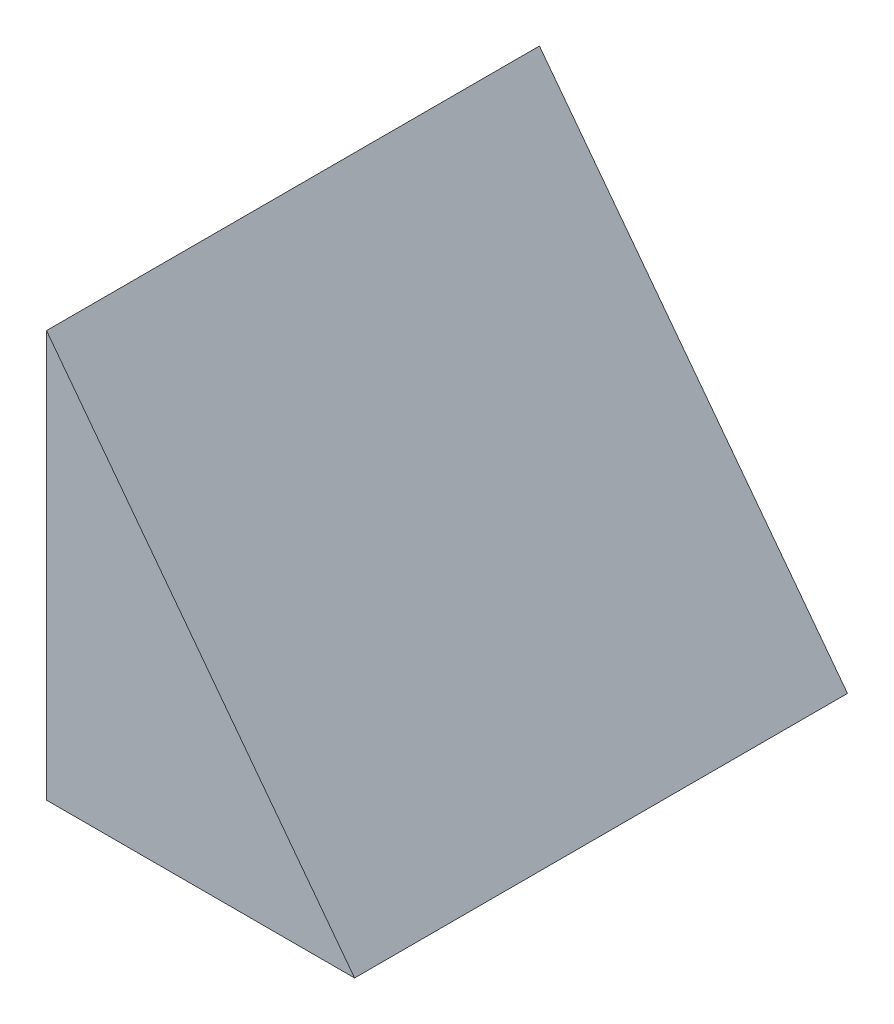
ISO-10303-21;
HEADER;
FILE_DESCRIPTION(('STEP AP214'),'2;1');
FILE_NAME('part.step','',(''),(''),'','','');
FILE_SCHEMA(('AUTOMOTIVE_DESIGN { 1 0 10303 214 1 1 1 1 }'));
ENDSEC;
DATA;
#1=APPLICATION_CONTEXT('core data for automotive mechanical design processes');
#2=APPLICATION_PROTOCOL_DEFINITION('international standard','automotive_design',2000,#1);
#3=PRODUCT_CONTEXT('',#1,'mechanical');
#4=PRODUCT('Part','Part','',(#3));
#5=PRODUCT_RELATED_PRODUCT_CATEGORY('part','',(#4));
#6=PRODUCT_DEFINITION_FORMATION('','',#4);
#7=PRODUCT_DEFINITION_CONTEXT('part definition',#1,'design');
#8=PRODUCT_DEFINITION('design','',#6,#7);
#9=PRODUCT_DEFINITION_SHAPE('','',#8);
#10=(LENGTH_UNIT() NAMED_UNIT(*) SI_UNIT(.MILLI.,.METRE.));
#11=(NAMED_UNIT(*) PLANE_ANGLE_UNIT() SI_UNIT($,.RADIAN.));
#12=(NAMED_UNIT(*) SI_UNIT($,.STERADIAN.) SOLID_ANGLE_UNIT());
#13=UNCERTAINTY_MEASURE_WITH_UNIT(LENGTH_MEASURE(1.E-05),#10,'distance_accuracy_value','');
#14=(GEOMETRIC_REPRESENTATION_CONTEXT(3) GLOBAL_UNCERTAINTY_ASSIGNED_CONTEXT((#13)) GLOBAL_UNIT_ASSIGNED_CONTEXT((#10,
#11,#12)) REPRESENTATION_CONTEXT('',''));
#15=CARTESIAN_POINT('',(0.,0.,0.));
#16=DIRECTION('',(0.,0.,1.));
#17=DIRECTION('',(1.,0.,0.));
#18=AXIS2_PLACEMENT_3D('',#15,#16,#17);
#19=CARTESIAN_POINT('',(635.,0.,-1016.));
#20=DIRECTION('',(0.,-1.,0.));
#21=DIRECTION('',(1.,0.,0.));
#22=AXIS2_PLACEMENT_3D('',#19,#20,#21);
#23=PLANE('',#22);
#24=DIRECTION('',(1.,0.,0.));
#25=VECTOR('',#24,1.);
#26=CARTESIAN_POINT('',(635.,0.,0.));
#27=LINE('',#26,#25);
#28=CARTESIAN_POINT('',(0.,0.,0.));
#29=VERTEX_POINT('',#28);
#30=CARTESIAN_POINT('',(635.,0.,0.));
#31=VERTEX_POINT('',#30);
#32=EDGE_CURVE('E84',#29,#31,#27,.T.);
#33=ORIENTED_EDGE('',*,*,#32,.F.);
#34=DIRECTION('',(0.,0.,1.));
#35=VECTOR('',#34,1.);
#36=CARTESIAN_POINT('',(0.,0.,-1016.));
#37=LINE('',#36,#35);
#38=CARTESIAN_POINT('',(0.,0.,-1016.));
#39=VERTEX_POINT('',#38);
#40=EDGE_CURVE('E11',#39,#29,#37,.T.);
#41=ORIENTED_EDGE('',*,*,#40,.F.);
#42=DIRECTION('',(1.,0.,0.));
#43=VECTOR('',#42,1.);
#44=CARTESIAN_POINT('',(635.,0.,-1016.));
#45=LINE('',#44,#43);
#46=CARTESIAN_POINT('',(635.,0.,-1016.));
#47=VERTEX_POINT('',#46);
#48=EDGE_CURVE('E76',#39,#47,#45,.T.);
#49=ORIENTED_EDGE('',*,*,#48,.T.);
#50=DIRECTION('',(0.,0.,1.));
#51=VECTOR('',#50,1.);
#52=CARTESIAN_POINT('',(635.,0.,-1016.));
#53=LINE('',#52,#51);
#54=EDGE_CURVE('E35',#47,#31,#53,.T.);
#55=ORIENTED_EDGE('',*,*,#54,.T.);
#56=EDGE_LOOP('',(#33,#41,#49,#55));
#57=FACE_BOUND('',#56,.T.);
#58=ADVANCED_FACE('F32',(#57),#23,.T.);
#59=CARTESIAN_POINT('',(0.,0.,-1016.));
#60=DIRECTION('',(-1.,0.,0.));
#61=DIRECTION('',(0.,0.,1.));
#62=AXIS2_PLACEMENT_3D('',#59,#60,#61);
#63=PLANE('',#62);
#64=DIRECTION('',(0.,-1.,0.));
#65=VECTOR('',#64,1.);
#66=CARTESIAN_POINT('',(0.,0.,0.));
#67=LINE('',#66,#65);
#68=CARTESIAN_POINT('',(0.,838.2,0.));
#69=VERTEX_POINT('',#68);
#70=EDGE_CURVE('E78',#69,#29,#67,.T.);
#71=ORIENTED_EDGE('',*,*,#70,.F.);
#72=DIRECTION('',(0.,0.,1.));
#73=VECTOR('',#72,1.);
#74=CARTESIAN_POINT('',(0.,838.2,-1016.));
#75=LINE('',#74,#73);
#76=CARTESIAN_POINT('',(0.,838.2,-1016.));
#77=VERTEX_POINT('',#76);
#78=EDGE_CURVE('E41',#77,#69,#75,.T.);
#79=ORIENTED_EDGE('',*,*,#78,.F.);
#80=DIRECTION('',(0.,-1.,0.));
#81=VECTOR('',#80,1.);
#82=CARTESIAN_POINT('',(0.,0.,-1016.));
#83=LINE('',#82,#81);
#84=EDGE_CURVE('E73',#77,#39,#83,.T.);
#85=ORIENTED_EDGE('',*,*,#84,.T.);
#86=ORIENTED_EDGE('',*,*,#40,.T.);
#87=EDGE_LOOP('',(#71,#79,#85,#86));
#88=FACE_BOUND('',#87,.T.);
#89=ADVANCED_FACE('F88',(#88),#63,.T.);
#90=CARTESIAN_POINT('',(0.,838.2,-1016.));
#91=DIRECTION('',(0.79709214815401,0.603857687995462,0.));
#92=DIRECTION('',(-0.603857687995462,0.79709214815401,0.));
#93=AXIS2_PLACEMENT_3D('',#90,#91,#92);
#94=PLANE('',#93);
#95=DIRECTION('',(-0.603857687995462,0.79709214815401,0.));
#96=VECTOR('',#95,1.);
#97=CARTESIAN_POINT('',(0.,838.2,0.));
#98=LINE('',#97,#96);
#99=EDGE_CURVE('E71',#31,#69,#98,.T.);
#100=ORIENTED_EDGE('',*,*,#99,.F.);
#101=ORIENTED_EDGE('',*,*,#54,.F.);
#102=DIRECTION('',(-0.603857687995462,0.79709214815401,0.));
#103=VECTOR('',#102,1.);
#104=CARTESIAN_POINT('',(0.,838.2,-1016.));
#105=LINE('',#104,#103);
#106=EDGE_CURVE('E69',#47,#77,#105,.T.);
#107=ORIENTED_EDGE('',*,*,#106,.T.);
#108=ORIENTED_EDGE('',*,*,#78,.T.);
#109=EDGE_LOOP('',(#100,#101,#107,#108));
#110=FACE_BOUND('',#109,.T.);
#111=ADVANCED_FACE('F68',(#110),#94,.T.);
#112=CARTESIAN_POINT('',(0.,0.,-1016.));
#113=DIRECTION('',(0.,0.,-1.));
#114=DIRECTION('',(-1.,0.,0.));
#115=AXIS2_PLACEMENT_3D('',#112,#113,#114);
#116=PLANE('',#115);
#117=ORIENTED_EDGE('',*,*,#48,.F.);
#118=ORIENTED_EDGE('',*,*,#84,.F.);
#119=ORIENTED_EDGE('',*,*,#106,.F.);
#120=EDGE_LOOP('',(#117,#118,#119));
#121=FACE_BOUND('',#120,.T.);
#122=ADVANCED_FACE('F75',(#121),#116,.T.);
#123=CARTESIAN_POINT('',(0.,0.,0.));
#124=DIRECTION('',(0.,0.,-1.));
#125=DIRECTION('',(-1.,0.,0.));
#126=AXIS2_PLACEMENT_3D('',#123,#124,#125);
#127=PLANE('',#126);
#128=ORIENTED_EDGE('',*,*,#32,.T.);
#129=ORIENTED_EDGE('',*,*,#99,.T.);
#130=ORIENTED_EDGE('',*,*,#70,.T.);
#131=EDGE_LOOP('',(#128,#129,#130));
#132=FACE_BOUND('',#131,.T.);
#133=ADVANCED_FACE('F87',(#132),#127,.F.);
#134=CLOSED_SHELL('',(#58,#89,#111,#122,#133));
#135=MANIFOLD_SOLID_BREP('B2',#134);
#136=ADVANCED_BREP_SHAPE_REPRESENTATION('',(#18,#135),#14);
#137=SHAPE_DEFINITION_REPRESENTATION(#9,#136);
ENDSEC;
END-ISO-10303-21;
